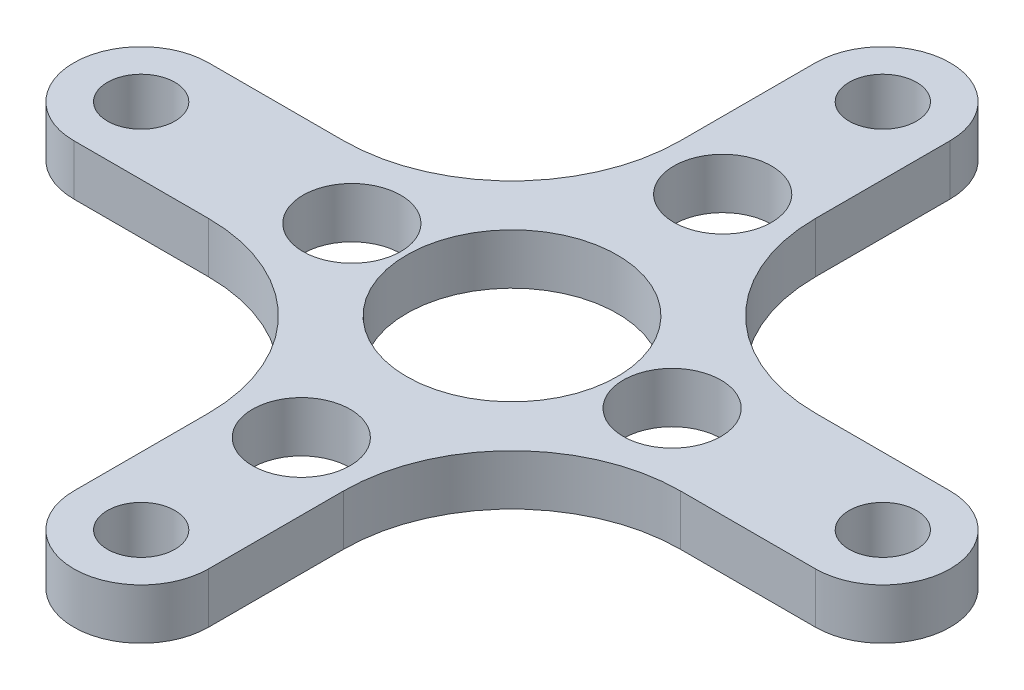
ISO-10303-21;
HEADER;
FILE_DESCRIPTION(('STEP AP214'),'2;1');
FILE_NAME('part.step','',(''),(''),'','','');
FILE_SCHEMA(('AUTOMOTIVE_DESIGN { 1 0 10303 214 1 1 1 1 }'));
ENDSEC;
DATA;
#1=APPLICATION_CONTEXT('core data for automotive mechanical design processes');
#2=APPLICATION_PROTOCOL_DEFINITION('international standard','automotive_design',2000,#1);
#3=PRODUCT_CONTEXT('',#1,'mechanical');
#4=PRODUCT('Part','Part','',(#3));
#5=PRODUCT_RELATED_PRODUCT_CATEGORY('part','',(#4));
#6=PRODUCT_DEFINITION_FORMATION('','',#4);
#7=PRODUCT_DEFINITION_CONTEXT('part definition',#1,'design');
#8=PRODUCT_DEFINITION('design','',#6,#7);
#9=PRODUCT_DEFINITION_SHAPE('','',#8);
#10=(LENGTH_UNIT() NAMED_UNIT(*) SI_UNIT(.MILLI.,.METRE.));
#11=(NAMED_UNIT(*) PLANE_ANGLE_UNIT() SI_UNIT($,.RADIAN.));
#12=(NAMED_UNIT(*) SI_UNIT($,.STERADIAN.) SOLID_ANGLE_UNIT());
#13=UNCERTAINTY_MEASURE_WITH_UNIT(LENGTH_MEASURE(1.E-05),#10,'distance_accuracy_value','');
#14=(GEOMETRIC_REPRESENTATION_CONTEXT(3) GLOBAL_UNCERTAINTY_ASSIGNED_CONTEXT((#13)) GLOBAL_UNIT_ASSIGNED_CONTEXT((#10,
#11,#12)) REPRESENTATION_CONTEXT('',''));
#15=CARTESIAN_POINT('',(0.,0.,0.));
#16=DIRECTION('',(0.,0.,1.));
#17=DIRECTION('',(1.,0.,0.));
#18=AXIS2_PLACEMENT_3D('',#15,#16,#17);
#19=CARTESIAN_POINT('',(3.99999999999985,3.,0.));
#20=DIRECTION('',(-1.,0.,0.));
#21=DIRECTION('',(0.,0.,1.));
#22=AXIS2_PLACEMENT_3D('',#19,#20,#21);
#23=PLANE('',#22);
#24=DIRECTION('',(0.,0.,-1.));
#25=VECTOR('',#24,1.);
#26=CARTESIAN_POINT('',(3.99999999999985,0.,0.));
#27=LINE('',#26,#25);
#28=CARTESIAN_POINT('',(4.00000000000009,0.,22.));
#29=VERTEX_POINT('',#28);
#30=CARTESIAN_POINT('',(4.,0.,14.0000000000001));
#31=VERTEX_POINT('',#30);
#32=EDGE_CURVE('E207',#29,#31,#27,.T.);
#33=ORIENTED_EDGE('',*,*,#32,.T.);
#34=DIRECTION('',(0.,-1.,0.));
#35=VECTOR('',#34,1.);
#36=CARTESIAN_POINT('',(4.,3.,14.0000000000001));
#37=LINE('',#36,#35);
#38=CARTESIAN_POINT('',(4.,3.,14.0000000000001));
#39=VERTEX_POINT('',#38);
#40=EDGE_CURVE('E11',#39,#31,#37,.T.);
#41=ORIENTED_EDGE('',*,*,#40,.F.);
#42=DIRECTION('',(0.,0.,-1.));
#43=VECTOR('',#42,1.);
#44=CARTESIAN_POINT('',(3.99999999999985,3.,0.));
#45=LINE('',#44,#43);
#46=CARTESIAN_POINT('',(4.00000000000009,3.,22.));
#47=VERTEX_POINT('',#46);
#48=EDGE_CURVE('E299',#47,#39,#45,.T.);
#49=ORIENTED_EDGE('',*,*,#48,.F.);
#50=DIRECTION('',(0.,-1.,0.));
#51=VECTOR('',#50,1.);
#52=CARTESIAN_POINT('',(4.00000000000009,3.,22.));
#53=LINE('',#52,#51);
#54=EDGE_CURVE('E182',#47,#29,#53,.T.);
#55=ORIENTED_EDGE('',*,*,#54,.T.);
#56=EDGE_LOOP('',(#33,#41,#49,#55));
#57=FACE_BOUND('',#56,.T.);
#58=ADVANCED_FACE('F36',(#57),#23,.F.);
#59=CARTESIAN_POINT('',(14.,3.,14.));
#60=DIRECTION('',(0.,-1.,0.));
#61=DIRECTION('',(0.,0.,-1.));
#62=AXIS2_PLACEMENT_3D('',#59,#60,#61);
#63=CYLINDRICAL_SURFACE('',#62,10.);
#64=CARTESIAN_POINT('',(14.,0.,14.));
#65=DIRECTION('',(0.,1.,0.));
#66=DIRECTION('',(0.,0.,1.));
#67=AXIS2_PLACEMENT_3D('',#64,#65,#66);
#68=CIRCLE('',#67,10.);
#69=CARTESIAN_POINT('',(14.0000000000001,0.,4.));
#70=VERTEX_POINT('',#69);
#71=EDGE_CURVE('E210',#31,#70,#68,.F.);
#72=ORIENTED_EDGE('',*,*,#71,.T.);
#73=DIRECTION('',(0.,-1.,0.));
#74=VECTOR('',#73,1.);
#75=CARTESIAN_POINT('',(14.0000000000001,3.,4.));
#76=LINE('',#75,#74);
#77=CARTESIAN_POINT('',(14.0000000000001,3.,4.));
#78=VERTEX_POINT('',#77);
#79=EDGE_CURVE('E45',#78,#70,#76,.T.);
#80=ORIENTED_EDGE('',*,*,#79,.F.);
#81=CARTESIAN_POINT('',(14.,3.,14.));
#82=DIRECTION('',(0.,1.,0.));
#83=DIRECTION('',(0.,0.,1.));
#84=AXIS2_PLACEMENT_3D('',#81,#82,#83);
#85=CIRCLE('',#84,10.);
#86=EDGE_CURVE('E116',#39,#78,#85,.F.);
#87=ORIENTED_EDGE('',*,*,#86,.F.);
#88=ORIENTED_EDGE('',*,*,#40,.T.);
#89=EDGE_LOOP('',(#72,#80,#87,#88));
#90=FACE_BOUND('',#89,.T.);
#91=ADVANCED_FACE('F282',(#90),#63,.F.);
#92=CARTESIAN_POINT('',(0.,3.,3.99999999999973));
#93=DIRECTION('',(0.,0.,1.));
#94=DIRECTION('',(1.,0.,0.));
#95=AXIS2_PLACEMENT_3D('',#92,#93,#94);
#96=PLANE('',#95);
#97=DIRECTION('',(-1.,0.,0.));
#98=VECTOR('',#97,1.);
#99=CARTESIAN_POINT('',(0.,0.,3.99999999999973));
#100=LINE('',#99,#98);
#101=CARTESIAN_POINT('',(22.,0.,4.00000000000007));
#102=VERTEX_POINT('',#101);
#103=EDGE_CURVE('E213',#102,#70,#100,.T.);
#104=ORIENTED_EDGE('',*,*,#103,.F.);
#105=DIRECTION('',(0.,-1.,0.));
#106=VECTOR('',#105,1.);
#107=CARTESIAN_POINT('',(22.,3.,4.00000000000007));
#108=LINE('',#107,#106);
#109=CARTESIAN_POINT('',(22.,3.,4.00000000000007));
#110=VERTEX_POINT('',#109);
#111=EDGE_CURVE('E275',#110,#102,#108,.T.);
#112=ORIENTED_EDGE('',*,*,#111,.F.);
#113=DIRECTION('',(-1.,0.,0.));
#114=VECTOR('',#113,1.);
#115=CARTESIAN_POINT('',(0.,3.,3.99999999999973));
#116=LINE('',#115,#114);
#117=EDGE_CURVE('E281',#110,#78,#116,.T.);
#118=ORIENTED_EDGE('',*,*,#117,.T.);
#119=ORIENTED_EDGE('',*,*,#79,.T.);
#120=EDGE_LOOP('',(#104,#112,#118,#119));
#121=FACE_BOUND('',#120,.T.);
#122=ADVANCED_FACE('F279',(#121),#96,.T.);
#123=CARTESIAN_POINT('',(22.,3.,0.));
#124=DIRECTION('',(0.,-1.,0.));
#125=DIRECTION('',(0.,0.,-1.));
#126=AXIS2_PLACEMENT_3D('',#123,#124,#125);
#127=CYLINDRICAL_SURFACE('',#126,4.);
#128=CARTESIAN_POINT('',(22.,0.,0.));
#129=DIRECTION('',(0.,1.,0.));
#130=DIRECTION('',(0.,0.,1.));
#131=AXIS2_PLACEMENT_3D('',#128,#129,#130);
#132=CIRCLE('',#131,4.);
#133=CARTESIAN_POINT('',(22.0000000000001,0.,-3.99999999999999));
#134=VERTEX_POINT('',#133);
#135=EDGE_CURVE('E216',#134,#102,#132,.F.);
#136=ORIENTED_EDGE('',*,*,#135,.F.);
#137=DIRECTION('',(0.,-1.,0.));
#138=VECTOR('',#137,1.);
#139=CARTESIAN_POINT('',(22.0000000000001,3.,-3.99999999999999));
#140=LINE('',#139,#138);
#141=CARTESIAN_POINT('',(22.0000000000001,3.,-3.99999999999999));
#142=VERTEX_POINT('',#141);
#143=EDGE_CURVE('E273',#142,#134,#140,.T.);
#144=ORIENTED_EDGE('',*,*,#143,.F.);
#145=CARTESIAN_POINT('',(22.,3.,0.));
#146=DIRECTION('',(0.,1.,0.));
#147=DIRECTION('',(0.,0.,1.));
#148=AXIS2_PLACEMENT_3D('',#145,#146,#147);
#149=CIRCLE('',#148,4.);
#150=EDGE_CURVE('E295',#142,#110,#149,.F.);
#151=ORIENTED_EDGE('',*,*,#150,.T.);
#152=ORIENTED_EDGE('',*,*,#111,.T.);
#153=EDGE_LOOP('',(#136,#144,#151,#152));
#154=FACE_BOUND('',#153,.T.);
#155=ADVANCED_FACE('F291',(#154),#127,.T.);
#156=CARTESIAN_POINT('',(0.,3.,-4.00000000000004));
#157=DIRECTION('',(0.,0.,1.));
#158=DIRECTION('',(1.,0.,0.));
#159=AXIS2_PLACEMENT_3D('',#156,#157,#158);
#160=PLANE('',#159);
#161=DIRECTION('',(-1.,0.,0.));
#162=VECTOR('',#161,1.);
#163=CARTESIAN_POINT('',(0.,0.,-4.00000000000004));
#164=LINE('',#163,#162);
#165=CARTESIAN_POINT('',(14.0000000000001,0.,-4.));
#166=VERTEX_POINT('',#165);
#167=EDGE_CURVE('E219',#134,#166,#164,.T.);
#168=ORIENTED_EDGE('',*,*,#167,.T.);
#169=DIRECTION('',(0.,-1.,0.));
#170=VECTOR('',#169,1.);
#171=CARTESIAN_POINT('',(14.0000000000001,3.,-4.));
#172=LINE('',#171,#170);
#173=CARTESIAN_POINT('',(14.0000000000001,3.,-4.));
#174=VERTEX_POINT('',#173);
#175=EDGE_CURVE('E271',#174,#166,#172,.T.);
#176=ORIENTED_EDGE('',*,*,#175,.F.);
#177=DIRECTION('',(-1.,0.,0.));
#178=VECTOR('',#177,1.);
#179=CARTESIAN_POINT('',(0.,3.,-4.00000000000004));
#180=LINE('',#179,#178);
#181=EDGE_CURVE('E297',#142,#174,#180,.T.);
#182=ORIENTED_EDGE('',*,*,#181,.F.);
#183=ORIENTED_EDGE('',*,*,#143,.T.);
#184=EDGE_LOOP('',(#168,#176,#182,#183));
#185=FACE_BOUND('',#184,.T.);
#186=ADVANCED_FACE('F572',(#185),#160,.F.);
#187=CARTESIAN_POINT('',(14.,3.,-14.));
#188=DIRECTION('',(0.,-1.,0.));
#189=DIRECTION('',(0.,0.,-1.));
#190=AXIS2_PLACEMENT_3D('',#187,#188,#189);
#191=CYLINDRICAL_SURFACE('',#190,10.);
#192=CARTESIAN_POINT('',(14.,0.,-14.));
#193=DIRECTION('',(0.,1.,0.));
#194=DIRECTION('',(0.,0.,1.));
#195=AXIS2_PLACEMENT_3D('',#192,#193,#194);
#196=CIRCLE('',#195,10.);
#197=CARTESIAN_POINT('',(4.,0.,-14.0000000000001));
#198=VERTEX_POINT('',#197);
#199=EDGE_CURVE('E222',#198,#166,#196,.T.);
#200=ORIENTED_EDGE('',*,*,#199,.F.);
#201=DIRECTION('',(0.,-1.,0.));
#202=VECTOR('',#201,1.);
#203=CARTESIAN_POINT('',(4.,3.,-14.0000000000001));
#204=LINE('',#203,#202);
#205=CARTESIAN_POINT('',(4.,3.,-14.0000000000001));
#206=VERTEX_POINT('',#205);
#207=EDGE_CURVE('E269',#206,#198,#204,.T.);
#208=ORIENTED_EDGE('',*,*,#207,.F.);
#209=CARTESIAN_POINT('',(14.,3.,-14.));
#210=DIRECTION('',(0.,1.,0.));
#211=DIRECTION('',(0.,0.,1.));
#212=AXIS2_PLACEMENT_3D('',#209,#210,#211);
#213=CIRCLE('',#212,10.);
#214=EDGE_CURVE('E304',#206,#174,#213,.T.);
#215=ORIENTED_EDGE('',*,*,#214,.T.);
#216=ORIENTED_EDGE('',*,*,#175,.T.);
#217=EDGE_LOOP('',(#200,#208,#215,#216));
#218=FACE_BOUND('',#217,.T.);
#219=ADVANCED_FACE('F562',(#218),#191,.F.);
#220=CARTESIAN_POINT('',(3.99999999999987,3.,0.));
#221=DIRECTION('',(1.,0.,0.));
#222=DIRECTION('',(0.,0.,-1.));
#223=AXIS2_PLACEMENT_3D('',#220,#221,#222);
#224=PLANE('',#223);
#225=DIRECTION('',(0.,0.,1.));
#226=VECTOR('',#225,1.);
#227=CARTESIAN_POINT('',(3.99999999999987,0.,0.));
#228=LINE('',#227,#226);
#229=CARTESIAN_POINT('',(4.00000000000008,0.,-22.));
#230=VERTEX_POINT('',#229);
#231=EDGE_CURVE('E225',#230,#198,#228,.T.);
#232=ORIENTED_EDGE('',*,*,#231,.F.);
#233=DIRECTION('',(0.,-1.,0.));
#234=VECTOR('',#233,1.);
#235=CARTESIAN_POINT('',(4.00000000000008,3.,-22.));
#236=LINE('',#235,#234);
#237=CARTESIAN_POINT('',(4.00000000000008,3.,-22.));
#238=VERTEX_POINT('',#237);
#239=EDGE_CURVE('E267',#238,#230,#236,.T.);
#240=ORIENTED_EDGE('',*,*,#239,.F.);
#241=DIRECTION('',(0.,0.,1.));
#242=VECTOR('',#241,1.);
#243=CARTESIAN_POINT('',(3.99999999999987,3.,0.));
#244=LINE('',#243,#242);
#245=EDGE_CURVE('E307',#238,#206,#244,.T.);
#246=ORIENTED_EDGE('',*,*,#245,.T.);
#247=ORIENTED_EDGE('',*,*,#207,.T.);
#248=EDGE_LOOP('',(#232,#240,#246,#247));
#249=FACE_BOUND('',#248,.T.);
#250=ADVANCED_FACE('F552',(#249),#224,.T.);
#251=CARTESIAN_POINT('',(0.,3.,-22.));
#252=DIRECTION('',(0.,-1.,0.));
#253=DIRECTION('',(0.,0.,-1.));
#254=AXIS2_PLACEMENT_3D('',#251,#252,#253);
#255=CYLINDRICAL_SURFACE('',#254,4.);
#256=CARTESIAN_POINT('',(0.,0.,-22.));
#257=DIRECTION('',(0.,1.,0.));
#258=DIRECTION('',(0.,0.,1.));
#259=AXIS2_PLACEMENT_3D('',#256,#257,#258);
#260=CIRCLE('',#259,4.);
#261=CARTESIAN_POINT('',(-4.,0.,-22.));
#262=VERTEX_POINT('',#261);
#263=EDGE_CURVE('E228',#262,#230,#260,.F.);
#264=ORIENTED_EDGE('',*,*,#263,.F.);
#265=DIRECTION('',(0.,-1.,0.));
#266=VECTOR('',#265,1.);
#267=CARTESIAN_POINT('',(-4.,3.,-22.));
#268=LINE('',#267,#266);
#269=CARTESIAN_POINT('',(-4.,3.,-22.));
#270=VERTEX_POINT('',#269);
#271=EDGE_CURVE('E265',#270,#262,#268,.T.);
#272=ORIENTED_EDGE('',*,*,#271,.F.);
#273=CARTESIAN_POINT('',(0.,3.,-22.));
#274=DIRECTION('',(0.,1.,0.));
#275=DIRECTION('',(0.,0.,1.));
#276=AXIS2_PLACEMENT_3D('',#273,#274,#275);
#277=CIRCLE('',#276,4.);
#278=EDGE_CURVE('E310',#270,#238,#277,.F.);
#279=ORIENTED_EDGE('',*,*,#278,.T.);
#280=ORIENTED_EDGE('',*,*,#239,.T.);
#281=EDGE_LOOP('',(#264,#272,#279,#280));
#282=FACE_BOUND('',#281,.T.);
#283=ADVANCED_FACE('F542',(#282),#255,.T.);
#284=CARTESIAN_POINT('',(-4.,3.,0.));
#285=DIRECTION('',(1.,0.,0.));
#286=DIRECTION('',(0.,0.,-1.));
#287=AXIS2_PLACEMENT_3D('',#284,#285,#286);
#288=PLANE('',#287);
#289=DIRECTION('',(0.,0.,1.));
#290=VECTOR('',#289,1.);
#291=CARTESIAN_POINT('',(-4.,0.,0.));
#292=LINE('',#291,#290);
#293=CARTESIAN_POINT('',(-4.,0.,-14.0000000000001));
#294=VERTEX_POINT('',#293);
#295=EDGE_CURVE('E231',#262,#294,#292,.T.);
#296=ORIENTED_EDGE('',*,*,#295,.T.);
#297=DIRECTION('',(0.,-1.,0.));
#298=VECTOR('',#297,1.);
#299=CARTESIAN_POINT('',(-4.,3.,-14.0000000000001));
#300=LINE('',#299,#298);
#301=CARTESIAN_POINT('',(-4.,3.,-14.0000000000001));
#302=VERTEX_POINT('',#301);
#303=EDGE_CURVE('E262',#302,#294,#300,.T.);
#304=ORIENTED_EDGE('',*,*,#303,.F.);
#305=DIRECTION('',(0.,0.,1.));
#306=VECTOR('',#305,1.);
#307=CARTESIAN_POINT('',(-4.,3.,0.));
#308=LINE('',#307,#306);
#309=EDGE_CURVE('E313',#270,#302,#308,.T.);
#310=ORIENTED_EDGE('',*,*,#309,.F.);
#311=ORIENTED_EDGE('',*,*,#271,.T.);
#312=EDGE_LOOP('',(#296,#304,#310,#311));
#313=FACE_BOUND('',#312,.T.);
#314=ADVANCED_FACE('F532',(#313),#288,.F.);
#315=CARTESIAN_POINT('',(-14.,3.,-14.));
#316=DIRECTION('',(0.,-1.,0.));
#317=DIRECTION('',(0.,0.,-1.));
#318=AXIS2_PLACEMENT_3D('',#315,#316,#317);
#319=CYLINDRICAL_SURFACE('',#318,10.);
#320=CARTESIAN_POINT('',(-14.,0.,-14.));
#321=DIRECTION('',(0.,1.,0.));
#322=DIRECTION('',(0.,0.,1.));
#323=AXIS2_PLACEMENT_3D('',#320,#321,#322);
#324=CIRCLE('',#323,10.);
#325=CARTESIAN_POINT('',(-14.0000000000001,0.,-4.));
#326=VERTEX_POINT('',#325);
#327=EDGE_CURVE('E233',#294,#326,#324,.F.);
#328=ORIENTED_EDGE('',*,*,#327,.T.);
#329=DIRECTION('',(0.,-1.,0.));
#330=VECTOR('',#329,1.);
#331=CARTESIAN_POINT('',(-14.0000000000001,3.,-4.));
#332=LINE('',#331,#330);
#333=CARTESIAN_POINT('',(-14.0000000000001,3.,-4.));
#334=VERTEX_POINT('',#333);
#335=EDGE_CURVE('E260',#334,#326,#332,.T.);
#336=ORIENTED_EDGE('',*,*,#335,.F.);
#337=CARTESIAN_POINT('',(-14.,3.,-14.));
#338=DIRECTION('',(0.,1.,0.));
#339=DIRECTION('',(0.,0.,1.));
#340=AXIS2_PLACEMENT_3D('',#337,#338,#339);
#341=CIRCLE('',#340,10.);
#342=EDGE_CURVE('E315',#302,#334,#341,.F.);
#343=ORIENTED_EDGE('',*,*,#342,.F.);
#344=ORIENTED_EDGE('',*,*,#303,.T.);
#345=EDGE_LOOP('',(#328,#336,#343,#344));
#346=FACE_BOUND('',#345,.T.);
#347=ADVANCED_FACE('F522',(#346),#319,.F.);
#348=CARTESIAN_POINT('',(0.,3.,-4.));
#349=DIRECTION('',(0.,0.,-1.));
#350=DIRECTION('',(-1.,0.,0.));
#351=AXIS2_PLACEMENT_3D('',#348,#349,#350);
#352=PLANE('',#351);
#353=DIRECTION('',(1.,0.,0.));
#354=VECTOR('',#353,1.);
#355=CARTESIAN_POINT('',(0.,0.,-4.));
#356=LINE('',#355,#354);
#357=CARTESIAN_POINT('',(-22.,0.,-4.));
#358=VERTEX_POINT('',#357);
#359=EDGE_CURVE('E236',#358,#326,#356,.T.);
#360=ORIENTED_EDGE('',*,*,#359,.F.);
#361=DIRECTION('',(0.,-1.,0.));
#362=VECTOR('',#361,1.);
#363=CARTESIAN_POINT('',(-22.,3.,-4.));
#364=LINE('',#363,#362);
#365=CARTESIAN_POINT('',(-22.,3.,-4.));
#366=VERTEX_POINT('',#365);
#367=EDGE_CURVE('E258',#366,#358,#364,.T.);
#368=ORIENTED_EDGE('',*,*,#367,.F.);
#369=DIRECTION('',(1.,0.,0.));
#370=VECTOR('',#369,1.);
#371=CARTESIAN_POINT('',(0.,3.,-4.));
#372=LINE('',#371,#370);
#373=EDGE_CURVE('E317',#366,#334,#372,.T.);
#374=ORIENTED_EDGE('',*,*,#373,.T.);
#375=ORIENTED_EDGE('',*,*,#335,.T.);
#376=EDGE_LOOP('',(#360,#368,#374,#375));
#377=FACE_BOUND('',#376,.T.);
#378=ADVANCED_FACE('F513',(#377),#352,.T.);
#379=CARTESIAN_POINT('',(-22.,3.,0.));
#380=DIRECTION('',(0.,-1.,0.));
#381=DIRECTION('',(0.,0.,-1.));
#382=AXIS2_PLACEMENT_3D('',#379,#380,#381);
#383=CYLINDRICAL_SURFACE('',#382,4.);
#384=CARTESIAN_POINT('',(-22.,0.,0.));
#385=DIRECTION('',(0.,1.,0.));
#386=DIRECTION('',(0.,0.,1.));
#387=AXIS2_PLACEMENT_3D('',#384,#385,#386);
#388=CIRCLE('',#387,4.);
#389=CARTESIAN_POINT('',(-21.9999999999999,0.,4.00000000000003));
#390=VERTEX_POINT('',#389);
#391=EDGE_CURVE('E239',#358,#390,#388,.T.);
#392=ORIENTED_EDGE('',*,*,#391,.T.);
#393=DIRECTION('',(0.,-1.,0.));
#394=VECTOR('',#393,1.);
#395=CARTESIAN_POINT('',(-21.9999999999999,3.,4.00000000000003));
#396=LINE('',#395,#394);
#397=CARTESIAN_POINT('',(-21.9999999999999,3.,4.00000000000003));
#398=VERTEX_POINT('',#397);
#399=EDGE_CURVE('E255',#398,#390,#396,.T.);
#400=ORIENTED_EDGE('',*,*,#399,.F.);
#401=CARTESIAN_POINT('',(-22.,3.,0.));
#402=DIRECTION('',(0.,1.,0.));
#403=DIRECTION('',(0.,0.,1.));
#404=AXIS2_PLACEMENT_3D('',#401,#402,#403);
#405=CIRCLE('',#404,4.);
#406=EDGE_CURVE('E320',#366,#398,#405,.T.);
#407=ORIENTED_EDGE('',*,*,#406,.F.);
#408=ORIENTED_EDGE('',*,*,#367,.T.);
#409=EDGE_LOOP('',(#392,#400,#407,#408));
#410=FACE_BOUND('',#409,.T.);
#411=ADVANCED_FACE('F325',(#410),#383,.T.);
#412=CARTESIAN_POINT('',(0.,3.,3.99999999999995));
#413=DIRECTION('',(0.,0.,-1.));
#414=DIRECTION('',(-1.,0.,0.));
#415=AXIS2_PLACEMENT_3D('',#412,#413,#414);
#416=PLANE('',#415);
#417=DIRECTION('',(1.,0.,0.));
#418=VECTOR('',#417,1.);
#419=CARTESIAN_POINT('',(0.,0.,3.99999999999995));
#420=LINE('',#419,#418);
#421=CARTESIAN_POINT('',(-14.0000000000001,0.,4.));
#422=VERTEX_POINT('',#421);
#423=EDGE_CURVE('E241',#390,#422,#420,.T.);
#424=ORIENTED_EDGE('',*,*,#423,.T.);
#425=DIRECTION('',(0.,-1.,0.));
#426=VECTOR('',#425,1.);
#427=CARTESIAN_POINT('',(-14.0000000000001,3.,4.));
#428=LINE('',#427,#426);
#429=CARTESIAN_POINT('',(-14.0000000000001,3.,4.));
#430=VERTEX_POINT('',#429);
#431=EDGE_CURVE('E165',#430,#422,#428,.T.);
#432=ORIENTED_EDGE('',*,*,#431,.F.);
#433=DIRECTION('',(1.,0.,0.));
#434=VECTOR('',#433,1.);
#435=CARTESIAN_POINT('',(0.,3.,3.99999999999995));
#436=LINE('',#435,#434);
#437=EDGE_CURVE('E171',#398,#430,#436,.T.);
#438=ORIENTED_EDGE('',*,*,#437,.F.);
#439=ORIENTED_EDGE('',*,*,#399,.T.);
#440=EDGE_LOOP('',(#424,#432,#438,#439));
#441=FACE_BOUND('',#440,.T.);
#442=ADVANCED_FACE('F329',(#441),#416,.F.);
#443=CARTESIAN_POINT('',(-14.,3.,14.));
#444=DIRECTION('',(0.,-1.,0.));
#445=DIRECTION('',(0.,0.,-1.));
#446=AXIS2_PLACEMENT_3D('',#443,#444,#445);
#447=CYLINDRICAL_SURFACE('',#446,10.);
#448=CARTESIAN_POINT('',(-14.,0.,14.));
#449=DIRECTION('',(0.,1.,0.));
#450=DIRECTION('',(0.,0.,1.));
#451=AXIS2_PLACEMENT_3D('',#448,#449,#450);
#452=CIRCLE('',#451,10.);
#453=CARTESIAN_POINT('',(-4.,0.,14.0000000000001));
#454=VERTEX_POINT('',#453);
#455=EDGE_CURVE('E160',#454,#422,#452,.T.);
#456=ORIENTED_EDGE('',*,*,#455,.F.);
#457=DIRECTION('',(0.,-1.,0.));
#458=VECTOR('',#457,1.);
#459=CARTESIAN_POINT('',(-4.,3.,14.0000000000001));
#460=LINE('',#459,#458);
#461=CARTESIAN_POINT('',(-4.,3.,14.0000000000001));
#462=VERTEX_POINT('',#461);
#463=EDGE_CURVE('E155',#462,#454,#460,.T.);
#464=ORIENTED_EDGE('',*,*,#463,.F.);
#465=CARTESIAN_POINT('',(-14.,3.,14.));
#466=DIRECTION('',(0.,1.,0.));
#467=DIRECTION('',(0.,0.,1.));
#468=AXIS2_PLACEMENT_3D('',#465,#466,#467);
#469=CIRCLE('',#468,10.);
#470=EDGE_CURVE('E158',#462,#430,#469,.T.);
#471=ORIENTED_EDGE('',*,*,#470,.T.);
#472=ORIENTED_EDGE('',*,*,#431,.T.);
#473=EDGE_LOOP('',(#456,#464,#471,#472));
#474=FACE_BOUND('',#473,.T.);
#475=ADVANCED_FACE('F157',(#474),#447,.F.);
#476=CARTESIAN_POINT('',(-3.9999999999996,3.,-1.14925430283454E-13));
#477=DIRECTION('',(-1.,0.,0.));
#478=DIRECTION('',(0.,0.,1.));
#479=AXIS2_PLACEMENT_3D('',#476,#477,#478);
#480=PLANE('',#479);
#481=DIRECTION('',(0.,0.,-1.));
#482=VECTOR('',#481,1.);
#483=CARTESIAN_POINT('',(-3.9999999999996,0.,-1.14925430283454E-13));
#484=LINE('',#483,#482);
#485=CARTESIAN_POINT('',(-4.00000000000023,0.,22.));
#486=VERTEX_POINT('',#485);
#487=EDGE_CURVE('E245',#486,#454,#484,.T.);
#488=ORIENTED_EDGE('',*,*,#487,.F.);
#489=DIRECTION('',(0.,-1.,0.));
#490=VECTOR('',#489,1.);
#491=CARTESIAN_POINT('',(-4.00000000000023,3.,22.));
#492=LINE('',#491,#490);
#493=CARTESIAN_POINT('',(-4.00000000000023,3.,22.));
#494=VERTEX_POINT('',#493);
#495=EDGE_CURVE('E105',#494,#486,#492,.T.);
#496=ORIENTED_EDGE('',*,*,#495,.F.);
#497=DIRECTION('',(0.,0.,-1.));
#498=VECTOR('',#497,1.);
#499=CARTESIAN_POINT('',(-3.9999999999996,3.,-1.14925430283454E-13));
#500=LINE('',#499,#498);
#501=EDGE_CURVE('E169',#494,#462,#500,.T.);
#502=ORIENTED_EDGE('',*,*,#501,.T.);
#503=ORIENTED_EDGE('',*,*,#463,.T.);
#504=EDGE_LOOP('',(#488,#496,#502,#503));
#505=FACE_BOUND('',#504,.T.);
#506=ADVANCED_FACE('F174',(#505),#480,.T.);
#507=CARTESIAN_POINT('',(0.,3.,22.));
#508=DIRECTION('',(0.,-1.,0.));
#509=DIRECTION('',(0.,0.,-1.));
#510=AXIS2_PLACEMENT_3D('',#507,#508,#509);
#511=CYLINDRICAL_SURFACE('',#510,4.00000000000016);
#512=CARTESIAN_POINT('',(0.,0.,22.));
#513=DIRECTION('',(0.,1.,0.));
#514=DIRECTION('',(0.,0.,1.));
#515=AXIS2_PLACEMENT_3D('',#512,#513,#514);
#516=CIRCLE('',#515,4.00000000000016);
#517=EDGE_CURVE('E108',#486,#29,#516,.T.);
#518=ORIENTED_EDGE('',*,*,#517,.T.);
#519=ORIENTED_EDGE('',*,*,#54,.F.);
#520=CARTESIAN_POINT('',(0.,3.,22.));
#521=DIRECTION('',(0.,1.,0.));
#522=DIRECTION('',(0.,0.,1.));
#523=AXIS2_PLACEMENT_3D('',#520,#521,#522);
#524=CIRCLE('',#523,4.00000000000016);
#525=EDGE_CURVE('E53',#494,#47,#524,.T.);
#526=ORIENTED_EDGE('',*,*,#525,.F.);
#527=ORIENTED_EDGE('',*,*,#495,.T.);
#528=EDGE_LOOP('',(#518,#519,#526,#527));
#529=FACE_BOUND('',#528,.T.);
#530=ADVANCED_FACE('F332',(#529),#511,.T.);
#531=CARTESIAN_POINT('',(-9.5,3.,0.));
#532=DIRECTION('',(0.,-1.,0.));
#533=DIRECTION('',(0.,0.,-1.));
#534=AXIS2_PLACEMENT_3D('',#531,#532,#533);
#535=CYLINDRICAL_SURFACE('',#534,2.9);
#536=CARTESIAN_POINT('',(-9.5,3.,0.));
#537=DIRECTION('',(0.,1.,0.));
#538=DIRECTION('',(0.,0.,1.));
#539=AXIS2_PLACEMENT_3D('',#536,#537,#538);
#540=CIRCLE('',#539,2.9);
#541=CARTESIAN_POINT('',(-9.5,3.,2.9));
#542=VERTEX_POINT('',#541);
#543=EDGE_CURVE('E661',#542,#542,#540,.F.);
#544=ORIENTED_EDGE('',*,*,#543,.F.);
#545=EDGE_LOOP('',(#544));
#546=FACE_BOUND('',#545,.T.);
#547=CARTESIAN_POINT('',(-9.5,0.,0.));
#548=DIRECTION('',(0.,1.,0.));
#549=DIRECTION('',(0.,0.,1.));
#550=AXIS2_PLACEMENT_3D('',#547,#548,#549);
#551=CIRCLE('',#550,2.9);
#552=CARTESIAN_POINT('',(-9.5,0.,2.9));
#553=VERTEX_POINT('',#552);
#554=EDGE_CURVE('E204',#553,#553,#551,.F.);
#555=ORIENTED_EDGE('',*,*,#554,.T.);
#556=EDGE_LOOP('',(#555));
#557=FACE_BOUND('',#556,.T.);
#558=ADVANCED_FACE('F334',(#546,#557),#535,.F.);
#559=CARTESIAN_POINT('',(0.,3.,-22.));
#560=DIRECTION('',(0.,-1.,0.));
#561=DIRECTION('',(0.,0.,-1.));
#562=AXIS2_PLACEMENT_3D('',#559,#560,#561);
#563=CYLINDRICAL_SURFACE('',#562,2.);
#564=CARTESIAN_POINT('',(0.,3.,-22.));
#565=DIRECTION('',(0.,1.,0.));
#566=DIRECTION('',(0.,0.,1.));
#567=AXIS2_PLACEMENT_3D('',#564,#565,#566);
#568=CIRCLE('',#567,2.);
#569=CARTESIAN_POINT('',(0.,3.,-20.));
#570=VERTEX_POINT('',#569);
#571=EDGE_CURVE('E658',#570,#570,#568,.F.);
#572=ORIENTED_EDGE('',*,*,#571,.F.);
#573=EDGE_LOOP('',(#572));
#574=FACE_BOUND('',#573,.T.);
#575=CARTESIAN_POINT('',(0.,0.,-22.));
#576=DIRECTION('',(0.,1.,0.));
#577=DIRECTION('',(0.,0.,1.));
#578=AXIS2_PLACEMENT_3D('',#575,#576,#577);
#579=CIRCLE('',#578,2.);
#580=CARTESIAN_POINT('',(0.,0.,-20.));
#581=VERTEX_POINT('',#580);
#582=EDGE_CURVE('E201',#581,#581,#579,.F.);
#583=ORIENTED_EDGE('',*,*,#582,.T.);
#584=EDGE_LOOP('',(#583));
#585=FACE_BOUND('',#584,.T.);
#586=ADVANCED_FACE('F340',(#574,#585),#563,.F.);
#587=CARTESIAN_POINT('',(0.,3.,22.));
#588=DIRECTION('',(0.,-1.,0.));
#589=DIRECTION('',(0.,0.,-1.));
#590=AXIS2_PLACEMENT_3D('',#587,#588,#589);
#591=CYLINDRICAL_SURFACE('',#590,2.);
#592=CARTESIAN_POINT('',(0.,3.,22.));
#593=DIRECTION('',(0.,1.,0.));
#594=DIRECTION('',(0.,0.,1.));
#595=AXIS2_PLACEMENT_3D('',#592,#593,#594);
#596=CIRCLE('',#595,2.);
#597=CARTESIAN_POINT('',(0.,3.,24.));
#598=VERTEX_POINT('',#597);
#599=EDGE_CURVE('E654',#598,#598,#596,.T.);
#600=ORIENTED_EDGE('',*,*,#599,.T.);
#601=EDGE_LOOP('',(#600));
#602=FACE_BOUND('',#601,.T.);
#603=CARTESIAN_POINT('',(0.,0.,22.));
#604=DIRECTION('',(0.,1.,0.));
#605=DIRECTION('',(0.,0.,1.));
#606=AXIS2_PLACEMENT_3D('',#603,#604,#605);
#607=CIRCLE('',#606,2.);
#608=CARTESIAN_POINT('',(0.,0.,24.));
#609=VERTEX_POINT('',#608);
#610=EDGE_CURVE('E198',#609,#609,#607,.T.);
#611=ORIENTED_EDGE('',*,*,#610,.F.);
#612=EDGE_LOOP('',(#611));
#613=FACE_BOUND('',#612,.T.);
#614=ADVANCED_FACE('F355',(#602,#613),#591,.F.);
#615=CARTESIAN_POINT('',(-22.,3.,0.));
#616=DIRECTION('',(0.,-1.,0.));
#617=DIRECTION('',(0.,0.,-1.));
#618=AXIS2_PLACEMENT_3D('',#615,#616,#617);
#619=CYLINDRICAL_SURFACE('',#618,2.);
#620=CARTESIAN_POINT('',(-22.,3.,0.));
#621=DIRECTION('',(0.,1.,0.));
#622=DIRECTION('',(0.,0.,1.));
#623=AXIS2_PLACEMENT_3D('',#620,#621,#622);
#624=CIRCLE('',#623,2.);
#625=CARTESIAN_POINT('',(-22.,3.,2.));
#626=VERTEX_POINT('',#625);
#627=EDGE_CURVE('E650',#626,#626,#624,.T.);
#628=ORIENTED_EDGE('',*,*,#627,.T.);
#629=EDGE_LOOP('',(#628));
#630=FACE_BOUND('',#629,.T.);
#631=CARTESIAN_POINT('',(-22.,0.,0.));
#632=DIRECTION('',(0.,1.,0.));
#633=DIRECTION('',(0.,0.,1.));
#634=AXIS2_PLACEMENT_3D('',#631,#632,#633);
#635=CIRCLE('',#634,2.);
#636=CARTESIAN_POINT('',(-22.,0.,2.));
#637=VERTEX_POINT('',#636);
#638=EDGE_CURVE('E195',#637,#637,#635,.T.);
#639=ORIENTED_EDGE('',*,*,#638,.F.);
#640=EDGE_LOOP('',(#639));
#641=FACE_BOUND('',#640,.T.);
#642=ADVANCED_FACE('F359',(#630,#641),#619,.F.);
#643=CARTESIAN_POINT('',(0.,3.,0.));
#644=DIRECTION('',(0.,-1.,0.));
#645=DIRECTION('',(0.,0.,-1.));
#646=AXIS2_PLACEMENT_3D('',#643,#644,#645);
#647=CYLINDRICAL_SURFACE('',#646,6.25);
#648=CARTESIAN_POINT('',(0.,3.,0.));
#649=DIRECTION('',(0.,1.,0.));
#650=DIRECTION('',(0.,0.,1.));
#651=AXIS2_PLACEMENT_3D('',#648,#649,#650);
#652=CIRCLE('',#651,6.25);
#653=CARTESIAN_POINT('',(0.,3.,6.25));
#654=VERTEX_POINT('',#653);
#655=EDGE_CURVE('E646',#654,#654,#652,.T.);
#656=ORIENTED_EDGE('',*,*,#655,.T.);
#657=EDGE_LOOP('',(#656));
#658=FACE_BOUND('',#657,.T.);
#659=CARTESIAN_POINT('',(0.,0.,0.));
#660=DIRECTION('',(0.,1.,0.));
#661=DIRECTION('',(0.,0.,1.));
#662=AXIS2_PLACEMENT_3D('',#659,#660,#661);
#663=CIRCLE('',#662,6.25);
#664=CARTESIAN_POINT('',(0.,0.,6.25));
#665=VERTEX_POINT('',#664);
#666=EDGE_CURVE('E192',#665,#665,#663,.T.);
#667=ORIENTED_EDGE('',*,*,#666,.F.);
#668=EDGE_LOOP('',(#667));
#669=FACE_BOUND('',#668,.T.);
#670=ADVANCED_FACE('F363',(#658,#669),#647,.F.);
#671=CARTESIAN_POINT('',(9.5,3.,0.));
#672=DIRECTION('',(0.,-1.,0.));
#673=DIRECTION('',(0.,0.,-1.));
#674=AXIS2_PLACEMENT_3D('',#671,#672,#673);
#675=CYLINDRICAL_SURFACE('',#674,2.9);
#676=CARTESIAN_POINT('',(9.5,3.,0.));
#677=DIRECTION('',(0.,1.,0.));
#678=DIRECTION('',(0.,0.,1.));
#679=AXIS2_PLACEMENT_3D('',#676,#677,#678);
#680=CIRCLE('',#679,2.9);
#681=CARTESIAN_POINT('',(9.5,3.,2.9));
#682=VERTEX_POINT('',#681);
#683=EDGE_CURVE('E642',#682,#682,#680,.T.);
#684=ORIENTED_EDGE('',*,*,#683,.T.);
#685=EDGE_LOOP('',(#684));
#686=FACE_BOUND('',#685,.T.);
#687=CARTESIAN_POINT('',(9.5,0.,0.));
#688=DIRECTION('',(0.,1.,0.));
#689=DIRECTION('',(0.,0.,1.));
#690=AXIS2_PLACEMENT_3D('',#687,#688,#689);
#691=CIRCLE('',#690,2.9);
#692=CARTESIAN_POINT('',(9.5,0.,2.9));
#693=VERTEX_POINT('',#692);
#694=EDGE_CURVE('E189',#693,#693,#691,.T.);
#695=ORIENTED_EDGE('',*,*,#694,.F.);
#696=EDGE_LOOP('',(#695));
#697=FACE_BOUND('',#696,.T.);
#698=ADVANCED_FACE('F367',(#686,#697),#675,.F.);
#699=CARTESIAN_POINT('',(0.,3.,-12.5));
#700=DIRECTION('',(0.,-1.,0.));
#701=DIRECTION('',(0.,0.,-1.));
#702=AXIS2_PLACEMENT_3D('',#699,#700,#701);
#703=CYLINDRICAL_SURFACE('',#702,2.9);
#704=CARTESIAN_POINT('',(0.,3.,-12.5));
#705=DIRECTION('',(0.,1.,0.));
#706=DIRECTION('',(0.,0.,1.));
#707=AXIS2_PLACEMENT_3D('',#704,#705,#706);
#708=CIRCLE('',#707,2.9);
#709=CARTESIAN_POINT('',(0.,3.,-9.6));
#710=VERTEX_POINT('',#709);
#711=EDGE_CURVE('E382',#710,#710,#708,.T.);
#712=ORIENTED_EDGE('',*,*,#711,.T.);
#713=EDGE_LOOP('',(#712));
#714=FACE_BOUND('',#713,.T.);
#715=CARTESIAN_POINT('',(0.,0.,-12.5));
#716=DIRECTION('',(0.,1.,0.));
#717=DIRECTION('',(0.,0.,1.));
#718=AXIS2_PLACEMENT_3D('',#715,#716,#717);
#719=CIRCLE('',#718,2.9);
#720=CARTESIAN_POINT('',(0.,0.,-9.6));
#721=VERTEX_POINT('',#720);
#722=EDGE_CURVE('E186',#721,#721,#719,.T.);
#723=ORIENTED_EDGE('',*,*,#722,.F.);
#724=EDGE_LOOP('',(#723));
#725=FACE_BOUND('',#724,.T.);
#726=ADVANCED_FACE('F370',(#714,#725),#703,.F.);
#727=CARTESIAN_POINT('',(0.,3.,12.5));
#728=DIRECTION('',(0.,-1.,0.));
#729=DIRECTION('',(0.,0.,-1.));
#730=AXIS2_PLACEMENT_3D('',#727,#728,#729);
#731=CYLINDRICAL_SURFACE('',#730,2.9);
#732=CARTESIAN_POINT('',(0.,3.,12.5));
#733=DIRECTION('',(0.,1.,0.));
#734=DIRECTION('',(0.,0.,1.));
#735=AXIS2_PLACEMENT_3D('',#732,#733,#734);
#736=CIRCLE('',#735,2.9);
#737=CARTESIAN_POINT('',(0.,3.,15.4));
#738=VERTEX_POINT('',#737);
#739=EDGE_CURVE('E251',#738,#738,#736,.F.);
#740=ORIENTED_EDGE('',*,*,#739,.F.);
#741=EDGE_LOOP('',(#740));
#742=FACE_BOUND('',#741,.T.);
#743=CARTESIAN_POINT('',(0.,0.,12.5));
#744=DIRECTION('',(0.,1.,0.));
#745=DIRECTION('',(0.,0.,1.));
#746=AXIS2_PLACEMENT_3D('',#743,#744,#745);
#747=CIRCLE('',#746,2.9);
#748=CARTESIAN_POINT('',(0.,0.,15.4));
#749=VERTEX_POINT('',#748);
#750=EDGE_CURVE('E183',#749,#749,#747,.F.);
#751=ORIENTED_EDGE('',*,*,#750,.T.);
#752=EDGE_LOOP('',(#751));
#753=FACE_BOUND('',#752,.T.);
#754=ADVANCED_FACE('F38',(#742,#753),#731,.F.);
#755=CARTESIAN_POINT('',(22.,3.,0.));
#756=DIRECTION('',(0.,-1.,0.));
#757=DIRECTION('',(0.,0.,-1.));
#758=AXIS2_PLACEMENT_3D('',#755,#756,#757);
#759=CYLINDRICAL_SURFACE('',#758,2.);
#760=CARTESIAN_POINT('',(22.,3.,0.));
#761=DIRECTION('',(0.,1.,0.));
#762=DIRECTION('',(0.,0.,1.));
#763=AXIS2_PLACEMENT_3D('',#760,#761,#762);
#764=CIRCLE('',#763,2.);
#765=CARTESIAN_POINT('',(22.,3.,2.));
#766=VERTEX_POINT('',#765);
#767=EDGE_CURVE('E176',#766,#766,#764,.F.);
#768=ORIENTED_EDGE('',*,*,#767,.F.);
#769=EDGE_LOOP('',(#768));
#770=FACE_BOUND('',#769,.T.);
#771=CARTESIAN_POINT('',(22.,0.,0.));
#772=DIRECTION('',(0.,1.,0.));
#773=DIRECTION('',(0.,0.,1.));
#774=AXIS2_PLACEMENT_3D('',#771,#772,#773);
#775=CIRCLE('',#774,2.);
#776=CARTESIAN_POINT('',(22.,0.,2.));
#777=VERTEX_POINT('',#776);
#778=EDGE_CURVE('E248',#777,#777,#775,.F.);
#779=ORIENTED_EDGE('',*,*,#778,.T.);
#780=EDGE_LOOP('',(#779));
#781=FACE_BOUND('',#780,.T.);
#782=ADVANCED_FACE('F377',(#770,#781),#759,.F.);
#783=CARTESIAN_POINT('',(0.,3.,0.));
#784=DIRECTION('',(0.,1.,0.));
#785=DIRECTION('',(0.,0.,1.));
#786=AXIS2_PLACEMENT_3D('',#783,#784,#785);
#787=PLANE('',#786);
#788=ORIENTED_EDGE('',*,*,#739,.T.);
#789=EDGE_LOOP('',(#788));
#790=FACE_BOUND('',#789,.T.);
#791=ORIENTED_EDGE('',*,*,#711,.F.);
#792=EDGE_LOOP('',(#791));
#793=FACE_BOUND('',#792,.T.);
#794=ORIENTED_EDGE('',*,*,#683,.F.);
#795=EDGE_LOOP('',(#794));
#796=FACE_BOUND('',#795,.T.);
#797=ORIENTED_EDGE('',*,*,#655,.F.);
#798=EDGE_LOOP('',(#797));
#799=FACE_BOUND('',#798,.T.);
#800=ORIENTED_EDGE('',*,*,#627,.F.);
#801=EDGE_LOOP('',(#800));
#802=FACE_BOUND('',#801,.T.);
#803=ORIENTED_EDGE('',*,*,#599,.F.);
#804=EDGE_LOOP('',(#803));
#805=FACE_BOUND('',#804,.T.);
#806=ORIENTED_EDGE('',*,*,#571,.T.);
#807=EDGE_LOOP('',(#806));
#808=FACE_BOUND('',#807,.T.);
#809=ORIENTED_EDGE('',*,*,#543,.T.);
#810=EDGE_LOOP('',(#809));
#811=FACE_BOUND('',#810,.T.);
#812=ORIENTED_EDGE('',*,*,#48,.T.);
#813=ORIENTED_EDGE('',*,*,#86,.T.);
#814=ORIENTED_EDGE('',*,*,#117,.F.);
#815=ORIENTED_EDGE('',*,*,#150,.F.);
#816=ORIENTED_EDGE('',*,*,#181,.T.);
#817=ORIENTED_EDGE('',*,*,#214,.F.);
#818=ORIENTED_EDGE('',*,*,#245,.F.);
#819=ORIENTED_EDGE('',*,*,#278,.F.);
#820=ORIENTED_EDGE('',*,*,#309,.T.);
#821=ORIENTED_EDGE('',*,*,#342,.T.);
#822=ORIENTED_EDGE('',*,*,#373,.F.);
#823=ORIENTED_EDGE('',*,*,#406,.T.);
#824=ORIENTED_EDGE('',*,*,#437,.T.);
#825=ORIENTED_EDGE('',*,*,#470,.F.);
#826=ORIENTED_EDGE('',*,*,#501,.F.);
#827=ORIENTED_EDGE('',*,*,#525,.T.);
#828=EDGE_LOOP('',(#812,#813,#814,#815,#816,#817,#818,#819,#820,#821,#822,#823,#824,#825,#826,#827));
#829=FACE_BOUND('',#828,.T.);
#830=ORIENTED_EDGE('',*,*,#767,.T.);
#831=EDGE_LOOP('',(#830));
#832=FACE_BOUND('',#831,.T.);
#833=ADVANCED_FACE('F167',(#790,#793,#796,#799,#802,#805,#808,#811,#829,#832),#787,.T.);
#834=CARTESIAN_POINT('',(0.,0.,0.));
#835=DIRECTION('',(0.,1.,0.));
#836=DIRECTION('',(0.,0.,1.));
#837=AXIS2_PLACEMENT_3D('',#834,#835,#836);
#838=PLANE('',#837);
#839=ORIENTED_EDGE('',*,*,#750,.F.);
#840=EDGE_LOOP('',(#839));
#841=FACE_BOUND('',#840,.T.);
#842=ORIENTED_EDGE('',*,*,#722,.T.);
#843=EDGE_LOOP('',(#842));
#844=FACE_BOUND('',#843,.T.);
#845=ORIENTED_EDGE('',*,*,#694,.T.);
#846=EDGE_LOOP('',(#845));
#847=FACE_BOUND('',#846,.T.);
#848=ORIENTED_EDGE('',*,*,#666,.T.);
#849=EDGE_LOOP('',(#848));
#850=FACE_BOUND('',#849,.T.);
#851=ORIENTED_EDGE('',*,*,#638,.T.);
#852=EDGE_LOOP('',(#851));
#853=FACE_BOUND('',#852,.T.);
#854=ORIENTED_EDGE('',*,*,#610,.T.);
#855=EDGE_LOOP('',(#854));
#856=FACE_BOUND('',#855,.T.);
#857=ORIENTED_EDGE('',*,*,#582,.F.);
#858=EDGE_LOOP('',(#857));
#859=FACE_BOUND('',#858,.T.);
#860=ORIENTED_EDGE('',*,*,#554,.F.);
#861=EDGE_LOOP('',(#860));
#862=FACE_BOUND('',#861,.T.);
#863=ORIENTED_EDGE('',*,*,#32,.F.);
#864=ORIENTED_EDGE('',*,*,#517,.F.);
#865=ORIENTED_EDGE('',*,*,#487,.T.);
#866=ORIENTED_EDGE('',*,*,#455,.T.);
#867=ORIENTED_EDGE('',*,*,#423,.F.);
#868=ORIENTED_EDGE('',*,*,#391,.F.);
#869=ORIENTED_EDGE('',*,*,#359,.T.);
#870=ORIENTED_EDGE('',*,*,#327,.F.);
#871=ORIENTED_EDGE('',*,*,#295,.F.);
#872=ORIENTED_EDGE('',*,*,#263,.T.);
#873=ORIENTED_EDGE('',*,*,#231,.T.);
#874=ORIENTED_EDGE('',*,*,#199,.T.);
#875=ORIENTED_EDGE('',*,*,#167,.F.);
#876=ORIENTED_EDGE('',*,*,#135,.T.);
#877=ORIENTED_EDGE('',*,*,#103,.T.);
#878=ORIENTED_EDGE('',*,*,#71,.F.);
#879=EDGE_LOOP('',(#863,#864,#865,#866,#867,#868,#869,#870,#871,#872,#873,#874,#875,#876,#877,#878));
#880=FACE_BOUND('',#879,.T.);
#881=ORIENTED_EDGE('',*,*,#778,.F.);
#882=EDGE_LOOP('',(#881));
#883=FACE_BOUND('',#882,.T.);
#884=ADVANCED_FACE('F286',(#841,#844,#847,#850,#853,#856,#859,#862,#880,#883),#838,.F.);
#885=CLOSED_SHELL('',(#58,#91,#122,#155,#186,#219,#250,#283,#314,#347,#378,#411,#442,#475,#506,
#530,#558,#586,#614,#642,#670,#698,#726,#754,#782,#833,#884));
#886=MANIFOLD_SOLID_BREP('B2',#885);
#887=ADVANCED_BREP_SHAPE_REPRESENTATION('',(#18,#886),#14);
#888=SHAPE_DEFINITION_REPRESENTATION(#9,#887);
ENDSEC;
END-ISO-10303-21;
